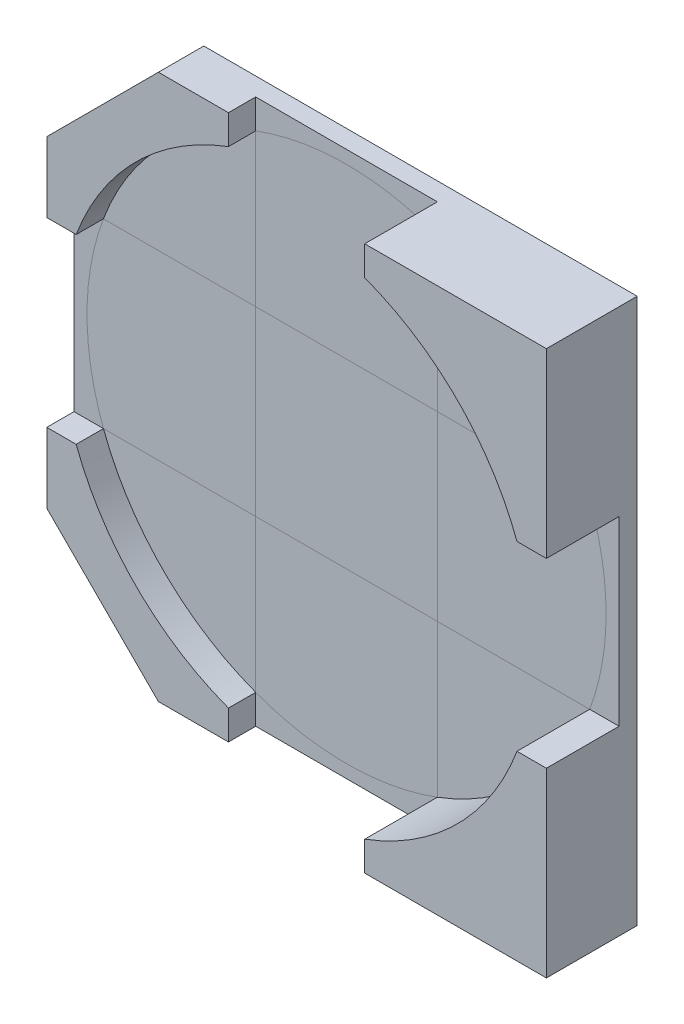
ISO-10303-21;
HEADER;
FILE_DESCRIPTION(('STEP AP214'),'2;1');
FILE_NAME('part.step','',(''),(''),'','','');
FILE_SCHEMA(('AUTOMOTIVE_DESIGN { 1 0 10303 214 1 1 1 1 }'));
ENDSEC;
DATA;
#1=APPLICATION_CONTEXT('core data for automotive mechanical design processes');
#2=APPLICATION_PROTOCOL_DEFINITION('international standard','automotive_design',2000,#1);
#3=PRODUCT_CONTEXT('',#1,'mechanical');
#4=PRODUCT('Part','Part','',(#3));
#5=PRODUCT_RELATED_PRODUCT_CATEGORY('part','',(#4));
#6=PRODUCT_DEFINITION_FORMATION('','',#4);
#7=PRODUCT_DEFINITION_CONTEXT('part definition',#1,'design');
#8=PRODUCT_DEFINITION('design','',#6,#7);
#9=PRODUCT_DEFINITION_SHAPE('','',#8);
#10=(LENGTH_UNIT() NAMED_UNIT(*) SI_UNIT(.MILLI.,.METRE.));
#11=(NAMED_UNIT(*) PLANE_ANGLE_UNIT() SI_UNIT($,.RADIAN.));
#12=(NAMED_UNIT(*) SI_UNIT($,.STERADIAN.) SOLID_ANGLE_UNIT());
#13=UNCERTAINTY_MEASURE_WITH_UNIT(LENGTH_MEASURE(1.E-05),#10,'distance_accuracy_value','');
#14=(GEOMETRIC_REPRESENTATION_CONTEXT(3) GLOBAL_UNCERTAINTY_ASSIGNED_CONTEXT((#13)) GLOBAL_UNIT_ASSIGNED_CONTEXT((#10,
#11,#12)) REPRESENTATION_CONTEXT('',''));
#15=CARTESIAN_POINT('',(0.,0.,0.));
#16=DIRECTION('',(0.,0.,1.));
#17=DIRECTION('',(1.,0.,0.));
#18=AXIS2_PLACEMENT_3D('',#15,#16,#17);
#19=CARTESIAN_POINT('',(0.,0.,0.349966666667));
#20=DIRECTION('',(0.,0.,1.));
#21=DIRECTION('',(1.,0.,0.));
#22=AXIS2_PLACEMENT_3D('',#19,#20,#21);
#23=PLANE('',#22);
#24=DIRECTION('',(1.,0.,0.));
#25=VECTOR('',#24,1.);
#26=CARTESIAN_POINT('',(-5.25,1.75,0.349966666667));
#27=LINE('',#26,#25);
#28=CARTESIAN_POINT('',(1.75,1.75,0.349966666667));
#29=VERTEX_POINT('',#28);
#30=CARTESIAN_POINT('',(4.683748498799,1.75,0.349966666667));
#31=VERTEX_POINT('',#30);
#32=EDGE_CURVE('E189',#29,#31,#27,.T.);
#33=ORIENTED_EDGE('',*,*,#32,.T.);
#34=CARTESIAN_POINT('',(0.,0.,0.349966666667));
#35=DIRECTION('',(0.,0.,1.));
#36=DIRECTION('',(1.,0.,0.));
#37=AXIS2_PLACEMENT_3D('',#34,#35,#36);
#38=CIRCLE('',#37,5.);
#39=CARTESIAN_POINT('',(1.75,4.683748498799,0.349966666667));
#40=VERTEX_POINT('',#39);
#41=EDGE_CURVE('E11',#31,#40,#38,.T.);
#42=ORIENTED_EDGE('',*,*,#41,.T.);
#43=DIRECTION('',(0.,1.,0.));
#44=VECTOR('',#43,1.);
#45=CARTESIAN_POINT('',(1.75,-5.25,0.349966666667));
#46=LINE('',#45,#44);
#47=EDGE_CURVE('E200',#29,#40,#46,.T.);
#48=ORIENTED_EDGE('',*,*,#47,.F.);
#49=EDGE_LOOP('',(#33,#42,#48));
#50=FACE_BOUND('',#49,.T.);
#51=ADVANCED_FACE('F17',(#50),#23,.T.);
#52=CARTESIAN_POINT('',(0.,0.,0.349966666667));
#53=DIRECTION('',(0.,0.,1.));
#54=DIRECTION('',(1.,0.,0.));
#55=AXIS2_PLACEMENT_3D('',#52,#53,#54);
#56=PLANE('',#55);
#57=CARTESIAN_POINT('',(0.,0.,0.349966666667));
#58=DIRECTION('',(0.,0.,1.));
#59=DIRECTION('',(1.,0.,0.));
#60=AXIS2_PLACEMENT_3D('',#57,#58,#59);
#61=CIRCLE('',#60,5.);
#62=CARTESIAN_POINT('',(1.75,-4.683748498799,0.349966666667));
#63=VERTEX_POINT('',#62);
#64=CARTESIAN_POINT('',(4.683748498799,-1.75,0.349966666667));
#65=VERTEX_POINT('',#64);
#66=EDGE_CURVE('E208',#63,#65,#61,.T.);
#67=ORIENTED_EDGE('',*,*,#66,.T.);
#68=DIRECTION('',(1.,0.,0.));
#69=VECTOR('',#68,1.);
#70=CARTESIAN_POINT('',(-5.25,-1.75,0.349966666667));
#71=LINE('',#70,#69);
#72=CARTESIAN_POINT('',(1.75,-1.75,0.349966666667));
#73=VERTEX_POINT('',#72);
#74=EDGE_CURVE('E28',#73,#65,#71,.T.);
#75=ORIENTED_EDGE('',*,*,#74,.F.);
#76=DIRECTION('',(0.,1.,0.));
#77=VECTOR('',#76,1.);
#78=CARTESIAN_POINT('',(1.75,-5.25,0.349966666667));
#79=LINE('',#78,#77);
#80=EDGE_CURVE('E283',#63,#73,#79,.T.);
#81=ORIENTED_EDGE('',*,*,#80,.F.);
#82=EDGE_LOOP('',(#67,#75,#81));
#83=FACE_BOUND('',#82,.T.);
#84=ADVANCED_FACE('F572',(#83),#56,.T.);
#85=CARTESIAN_POINT('',(0.,0.,0.349966666667));
#86=DIRECTION('',(0.,0.,1.));
#87=DIRECTION('',(1.,0.,0.));
#88=AXIS2_PLACEMENT_3D('',#85,#86,#87);
#89=CYLINDRICAL_SURFACE('',#88,5.);
#90=CARTESIAN_POINT('',(0.,0.,1.749833333333));
#91=DIRECTION('',(0.,0.,1.));
#92=DIRECTION('',(1.,0.,0.));
#93=AXIS2_PLACEMENT_3D('',#90,#91,#92);
#94=CIRCLE('',#93,5.);
#95=CARTESIAN_POINT('',(4.683748498799,1.75,1.749833333333));
#96=VERTEX_POINT('',#95);
#97=CARTESIAN_POINT('',(1.75,4.683748498799,1.749833333333));
#98=VERTEX_POINT('',#97);
#99=EDGE_CURVE('E236',#96,#98,#94,.T.);
#100=ORIENTED_EDGE('',*,*,#99,.T.);
#101=DIRECTION('',(0.,0.,1.));
#102=VECTOR('',#101,1.);
#103=CARTESIAN_POINT('',(1.75,4.683748498799,0.349966666667));
#104=LINE('',#103,#102);
#105=EDGE_CURVE('E421',#40,#98,#104,.T.);
#106=ORIENTED_EDGE('',*,*,#105,.F.);
#107=ORIENTED_EDGE('',*,*,#41,.F.);
#108=DIRECTION('',(0.,0.,1.));
#109=VECTOR('',#108,1.);
#110=CARTESIAN_POINT('',(4.683748498799,1.75,0.349966666667));
#111=LINE('',#110,#109);
#112=EDGE_CURVE('E383',#31,#96,#111,.T.);
#113=ORIENTED_EDGE('',*,*,#112,.T.);
#114=EDGE_LOOP('',(#100,#106,#107,#113));
#115=FACE_BOUND('',#114,.T.);
#116=ADVANCED_FACE('F577',(#115),#89,.F.);
#117=CARTESIAN_POINT('',(-5.25,-1.75,0.349966666667));
#118=DIRECTION('',(0.,0.,1.));
#119=DIRECTION('',(1.,0.,0.));
#120=AXIS2_PLACEMENT_3D('',#117,#118,#119);
#121=PLANE('',#120);
#122=ORIENTED_EDGE('',*,*,#32,.F.);
#123=DIRECTION('',(0.,1.,0.));
#124=VECTOR('',#123,1.);
#125=CARTESIAN_POINT('',(1.75,-5.25,0.349966666667));
#126=LINE('',#125,#124);
#127=EDGE_CURVE('E193',#73,#29,#126,.T.);
#128=ORIENTED_EDGE('',*,*,#127,.F.);
#129=ORIENTED_EDGE('',*,*,#74,.T.);
#130=CARTESIAN_POINT('',(0.,0.,0.349966666667));
#131=DIRECTION('',(0.,0.,1.));
#132=DIRECTION('',(1.,0.,0.));
#133=AXIS2_PLACEMENT_3D('',#130,#131,#132);
#134=CIRCLE('',#133,5.);
#135=CARTESIAN_POINT('',(5.,0.,0.349966666667));
#136=VERTEX_POINT('',#135);
#137=EDGE_CURVE('E42',#65,#136,#134,.T.);
#138=ORIENTED_EDGE('',*,*,#137,.T.);
#139=CARTESIAN_POINT('',(0.,0.,0.349966666667));
#140=DIRECTION('',(0.,0.,1.));
#141=DIRECTION('',(1.,0.,0.));
#142=AXIS2_PLACEMENT_3D('',#139,#140,#141);
#143=CIRCLE('',#142,5.);
#144=EDGE_CURVE('E195',#136,#31,#143,.T.);
#145=ORIENTED_EDGE('',*,*,#144,.T.);
#146=EDGE_LOOP('',(#122,#128,#129,#138,#145));
#147=FACE_BOUND('',#146,.T.);
#148=ADVANCED_FACE('F191',(#147),#121,.T.);
#149=CARTESIAN_POINT('',(-1.75,-5.25,0.349966666667));
#150=DIRECTION('',(0.,0.,1.));
#151=DIRECTION('',(1.,0.,0.));
#152=AXIS2_PLACEMENT_3D('',#149,#150,#151);
#153=PLANE('',#152);
#154=DIRECTION('',(0.,1.,0.));
#155=VECTOR('',#154,1.);
#156=CARTESIAN_POINT('',(-1.75,-5.25,0.349966666667));
#157=LINE('',#156,#155);
#158=CARTESIAN_POINT('',(-1.75,1.75,0.349966666667));
#159=VERTEX_POINT('',#158);
#160=CARTESIAN_POINT('',(-1.75,4.683748498799,0.349966666667));
#161=VERTEX_POINT('',#160);
#162=EDGE_CURVE('E222',#159,#161,#157,.T.);
#163=ORIENTED_EDGE('',*,*,#162,.F.);
#164=DIRECTION('',(1.,0.,0.));
#165=VECTOR('',#164,1.);
#166=CARTESIAN_POINT('',(-5.25,1.75,0.349966666667));
#167=LINE('',#166,#165);
#168=EDGE_CURVE('E214',#159,#29,#167,.T.);
#169=ORIENTED_EDGE('',*,*,#168,.T.);
#170=ORIENTED_EDGE('',*,*,#47,.T.);
#171=CARTESIAN_POINT('',(0.,0.,0.349966666667));
#172=DIRECTION('',(0.,0.,1.));
#173=DIRECTION('',(1.,0.,0.));
#174=AXIS2_PLACEMENT_3D('',#171,#172,#173);
#175=CIRCLE('',#174,5.);
#176=EDGE_CURVE('E425',#40,#161,#175,.T.);
#177=ORIENTED_EDGE('',*,*,#176,.T.);
#178=EDGE_LOOP('',(#163,#169,#170,#177));
#179=FACE_BOUND('',#178,.T.);
#180=ADVANCED_FACE('F220',(#179),#153,.T.);
#181=CARTESIAN_POINT('',(0.,0.,0.349966666667));
#182=DIRECTION('',(0.,0.,1.));
#183=DIRECTION('',(1.,0.,0.));
#184=AXIS2_PLACEMENT_3D('',#181,#182,#183);
#185=CYLINDRICAL_SURFACE('',#184,5.);
#186=DIRECTION('',(0.,0.,1.));
#187=VECTOR('',#186,1.);
#188=CARTESIAN_POINT('',(1.75,-4.683748498799,0.349966666667));
#189=LINE('',#188,#187);
#190=CARTESIAN_POINT('',(1.75,-4.683748498799,1.749833333333));
#191=VERTEX_POINT('',#190);
#192=EDGE_CURVE('E232',#63,#191,#189,.T.);
#193=ORIENTED_EDGE('',*,*,#192,.T.);
#194=CARTESIAN_POINT('',(0.,0.,1.749833333333));
#195=DIRECTION('',(0.,0.,1.));
#196=DIRECTION('',(1.,0.,0.));
#197=AXIS2_PLACEMENT_3D('',#194,#195,#196);
#198=CIRCLE('',#197,5.);
#199=CARTESIAN_POINT('',(4.683748498799,-1.75,1.749833333333));
#200=VERTEX_POINT('',#199);
#201=EDGE_CURVE('E305',#191,#200,#198,.T.);
#202=ORIENTED_EDGE('',*,*,#201,.T.);
#203=DIRECTION('',(0.,0.,1.));
#204=VECTOR('',#203,1.);
#205=CARTESIAN_POINT('',(4.683748498799,-1.75,0.349966666667));
#206=LINE('',#205,#204);
#207=EDGE_CURVE('E367',#65,#200,#206,.T.);
#208=ORIENTED_EDGE('',*,*,#207,.F.);
#209=ORIENTED_EDGE('',*,*,#66,.F.);
#210=EDGE_LOOP('',(#193,#202,#208,#209));
#211=FACE_BOUND('',#210,.T.);
#212=ADVANCED_FACE('F769',(#211),#185,.F.);
#213=CARTESIAN_POINT('',(-1.75,-5.25,0.349966666667));
#214=DIRECTION('',(0.,0.,1.));
#215=DIRECTION('',(1.,0.,0.));
#216=AXIS2_PLACEMENT_3D('',#213,#214,#215);
#217=PLANE('',#216);
#218=DIRECTION('',(0.,1.,0.));
#219=VECTOR('',#218,1.);
#220=CARTESIAN_POINT('',(-1.75,-5.25,0.349966666667));
#221=LINE('',#220,#219);
#222=CARTESIAN_POINT('',(-1.75,-4.683748498799,0.349966666667));
#223=VERTEX_POINT('',#222);
#224=CARTESIAN_POINT('',(-1.75,-1.75,0.349966666667));
#225=VERTEX_POINT('',#224);
#226=EDGE_CURVE('E400',#223,#225,#221,.T.);
#227=ORIENTED_EDGE('',*,*,#226,.F.);
#228=CARTESIAN_POINT('',(0.,0.,0.349966666667));
#229=DIRECTION('',(0.,0.,1.));
#230=DIRECTION('',(1.,0.,0.));
#231=AXIS2_PLACEMENT_3D('',#228,#229,#230);
#232=CIRCLE('',#231,5.);
#233=EDGE_CURVE('E351',#223,#63,#232,.T.);
#234=ORIENTED_EDGE('',*,*,#233,.T.);
#235=ORIENTED_EDGE('',*,*,#80,.T.);
#236=DIRECTION('',(1.,0.,0.));
#237=VECTOR('',#236,1.);
#238=CARTESIAN_POINT('',(-5.25,-1.75,0.349966666667));
#239=LINE('',#238,#237);
#240=EDGE_CURVE('E216',#225,#73,#239,.T.);
#241=ORIENTED_EDGE('',*,*,#240,.F.);
#242=EDGE_LOOP('',(#227,#234,#235,#241));
#243=FACE_BOUND('',#242,.T.);
#244=ADVANCED_FACE('F625',(#243),#217,.T.);
#245=CARTESIAN_POINT('',(-5.25,1.75,0.349966666667));
#246=DIRECTION('',(0.,1.,0.));
#247=DIRECTION('',(1.,0.,0.));
#248=AXIS2_PLACEMENT_3D('',#245,#246,#247);
#249=PLANE('',#248);
#250=DIRECTION('',(-1.,0.,0.));
#251=VECTOR('',#250,1.);
#252=CARTESIAN_POINT('',(-5.25,1.75,1.749833333333));
#253=LINE('',#252,#251);
#254=CARTESIAN_POINT('',(5.25,1.75,1.749833333333));
#255=VERTEX_POINT('',#254);
#256=EDGE_CURVE('E245',#255,#96,#253,.T.);
#257=ORIENTED_EDGE('',*,*,#256,.T.);
#258=ORIENTED_EDGE('',*,*,#112,.F.);
#259=DIRECTION('',(1.,0.,0.));
#260=VECTOR('',#259,1.);
#261=CARTESIAN_POINT('',(-5.25,1.75,0.349966666667));
#262=LINE('',#261,#260);
#263=CARTESIAN_POINT('',(5.25,1.75,0.349966666667));
#264=VERTEX_POINT('',#263);
#265=EDGE_CURVE('E370',#31,#264,#262,.T.);
#266=ORIENTED_EDGE('',*,*,#265,.T.);
#267=DIRECTION('',(0.,0.,1.));
#268=VECTOR('',#267,1.);
#269=CARTESIAN_POINT('',(5.25,1.75,0.349966666667));
#270=LINE('',#269,#268);
#271=EDGE_CURVE('E366',#264,#255,#270,.T.);
#272=ORIENTED_EDGE('',*,*,#271,.T.);
#273=EDGE_LOOP('',(#257,#258,#266,#272));
#274=FACE_BOUND('',#273,.T.);
#275=ADVANCED_FACE('F623',(#274),#249,.F.);
#276=CARTESIAN_POINT('',(-5.25,-1.75,0.349966666667));
#277=DIRECTION('',(0.,0.,1.));
#278=DIRECTION('',(1.,0.,0.));
#279=AXIS2_PLACEMENT_3D('',#276,#277,#278);
#280=PLANE('',#279);
#281=ORIENTED_EDGE('',*,*,#265,.F.);
#282=ORIENTED_EDGE('',*,*,#144,.F.);
#283=ORIENTED_EDGE('',*,*,#137,.F.);
#284=DIRECTION('',(1.,0.,0.));
#285=VECTOR('',#284,1.);
#286=CARTESIAN_POINT('',(-5.25,-1.75,0.349966666667));
#287=LINE('',#286,#285);
#288=CARTESIAN_POINT('',(5.25,-1.75,0.349966666667));
#289=VERTEX_POINT('',#288);
#290=EDGE_CURVE('E371',#65,#289,#287,.T.);
#291=ORIENTED_EDGE('',*,*,#290,.T.);
#292=DIRECTION('',(0.,1.,0.));
#293=VECTOR('',#292,1.);
#294=CARTESIAN_POINT('',(5.25,-1.75,0.349966666667));
#295=LINE('',#294,#293);
#296=EDGE_CURVE('E432',#289,#264,#295,.T.);
#297=ORIENTED_EDGE('',*,*,#296,.T.);
#298=EDGE_LOOP('',(#281,#282,#283,#291,#297));
#299=FACE_BOUND('',#298,.T.);
#300=ADVANCED_FACE('F598',(#299),#280,.T.);
#301=CARTESIAN_POINT('',(-5.25,-1.75,0.349966666667));
#302=DIRECTION('',(0.,1.,0.));
#303=DIRECTION('',(1.,0.,0.));
#304=AXIS2_PLACEMENT_3D('',#301,#302,#303);
#305=PLANE('',#304);
#306=DIRECTION('',(0.,0.,1.));
#307=VECTOR('',#306,1.);
#308=CARTESIAN_POINT('',(5.25,-1.75,0.349966666667));
#309=LINE('',#308,#307);
#310=CARTESIAN_POINT('',(5.25,-1.75,1.749833333333));
#311=VERTEX_POINT('',#310);
#312=EDGE_CURVE('E454',#289,#311,#309,.T.);
#313=ORIENTED_EDGE('',*,*,#312,.F.);
#314=ORIENTED_EDGE('',*,*,#290,.F.);
#315=ORIENTED_EDGE('',*,*,#207,.T.);
#316=DIRECTION('',(-1.,0.,0.));
#317=VECTOR('',#316,1.);
#318=CARTESIAN_POINT('',(-5.25,-1.75,1.749833333333));
#319=LINE('',#318,#317);
#320=EDGE_CURVE('E355',#311,#200,#319,.T.);
#321=ORIENTED_EDGE('',*,*,#320,.F.);
#322=EDGE_LOOP('',(#313,#314,#315,#321));
#323=FACE_BOUND('',#322,.T.);
#324=ADVANCED_FACE('F595',(#323),#305,.T.);
#325=CARTESIAN_POINT('',(-1.75,-5.25,0.349966666667));
#326=DIRECTION('',(0.,0.,1.));
#327=DIRECTION('',(1.,0.,0.));
#328=AXIS2_PLACEMENT_3D('',#325,#326,#327);
#329=PLANE('',#328);
#330=DIRECTION('',(0.,1.,0.));
#331=VECTOR('',#330,1.);
#332=CARTESIAN_POINT('',(-1.75,-5.25,0.349966666667));
#333=LINE('',#332,#331);
#334=CARTESIAN_POINT('',(-1.75,5.25,0.349966666667));
#335=VERTEX_POINT('',#334);
#336=EDGE_CURVE('E299',#161,#335,#333,.T.);
#337=ORIENTED_EDGE('',*,*,#336,.F.);
#338=ORIENTED_EDGE('',*,*,#176,.F.);
#339=DIRECTION('',(0.,1.,0.));
#340=VECTOR('',#339,1.);
#341=CARTESIAN_POINT('',(1.75,-5.25,0.349966666667));
#342=LINE('',#341,#340);
#343=CARTESIAN_POINT('',(1.75,5.25,0.349966666667));
#344=VERTEX_POINT('',#343);
#345=EDGE_CURVE('E21',#40,#344,#342,.T.);
#346=ORIENTED_EDGE('',*,*,#345,.T.);
#347=DIRECTION('',(1.,0.,0.));
#348=VECTOR('',#347,1.);
#349=CARTESIAN_POINT('',(-1.75,5.25,0.349966666667));
#350=LINE('',#349,#348);
#351=EDGE_CURVE('E278',#335,#344,#350,.T.);
#352=ORIENTED_EDGE('',*,*,#351,.F.);
#353=EDGE_LOOP('',(#337,#338,#346,#352));
#354=FACE_BOUND('',#353,.T.);
#355=ADVANCED_FACE('F19',(#354),#329,.T.);
#356=CARTESIAN_POINT('',(1.75,-5.25,0.349966666667));
#357=DIRECTION('',(1.,0.,0.));
#358=DIRECTION('',(0.,1.,0.));
#359=AXIS2_PLACEMENT_3D('',#356,#357,#358);
#360=PLANE('',#359);
#361=DIRECTION('',(0.,0.,1.));
#362=VECTOR('',#361,1.);
#363=CARTESIAN_POINT('',(1.75,5.25,0.349966666667));
#364=LINE('',#363,#362);
#365=CARTESIAN_POINT('',(1.75,5.25,1.749833333333));
#366=VERTEX_POINT('',#365);
#367=EDGE_CURVE('E388',#344,#366,#364,.T.);
#368=ORIENTED_EDGE('',*,*,#367,.F.);
#369=ORIENTED_EDGE('',*,*,#345,.F.);
#370=ORIENTED_EDGE('',*,*,#105,.T.);
#371=DIRECTION('',(0.,1.,0.));
#372=VECTOR('',#371,1.);
#373=CARTESIAN_POINT('',(1.75,-5.25,1.749833333333));
#374=LINE('',#373,#372);
#375=EDGE_CURVE('E218',#98,#366,#374,.T.);
#376=ORIENTED_EDGE('',*,*,#375,.T.);
#377=EDGE_LOOP('',(#368,#369,#370,#376));
#378=FACE_BOUND('',#377,.T.);
#379=ADVANCED_FACE('F654',(#378),#360,.F.);
#380=CARTESIAN_POINT('',(-5.25,-5.25,1.749833333333));
#381=DIRECTION('',(0.,0.,1.));
#382=DIRECTION('',(1.,0.,0.));
#383=AXIS2_PLACEMENT_3D('',#380,#381,#382);
#384=PLANE('',#383);
#385=ORIENTED_EDGE('',*,*,#375,.F.);
#386=ORIENTED_EDGE('',*,*,#99,.F.);
#387=ORIENTED_EDGE('',*,*,#256,.F.);
#388=DIRECTION('',(0.,1.,0.));
#389=VECTOR('',#388,1.);
#390=CARTESIAN_POINT('',(5.25,-5.25,1.749833333333));
#391=LINE('',#390,#389);
#392=CARTESIAN_POINT('',(5.25,5.25,1.749833333333));
#393=VERTEX_POINT('',#392);
#394=EDGE_CURVE('E298',#255,#393,#391,.T.);
#395=ORIENTED_EDGE('',*,*,#394,.T.);
#396=DIRECTION('',(1.,0.,0.));
#397=VECTOR('',#396,1.);
#398=CARTESIAN_POINT('',(-5.25,5.25,1.749833333333));
#399=LINE('',#398,#397);
#400=EDGE_CURVE('E500',#366,#393,#399,.T.);
#401=ORIENTED_EDGE('',*,*,#400,.F.);
#402=EDGE_LOOP('',(#385,#386,#387,#395,#401));
#403=FACE_BOUND('',#402,.T.);
#404=ADVANCED_FACE('F618',(#403),#384,.T.);
#405=CARTESIAN_POINT('',(-5.25,-1.75,0.349966666667));
#406=DIRECTION('',(0.,0.,1.));
#407=DIRECTION('',(1.,0.,0.));
#408=AXIS2_PLACEMENT_3D('',#405,#406,#407);
#409=PLANE('',#408);
#410=ORIENTED_EDGE('',*,*,#168,.F.);
#411=DIRECTION('',(0.,1.,0.));
#412=VECTOR('',#411,1.);
#413=CARTESIAN_POINT('',(-1.75,-5.25,0.349966666667));
#414=LINE('',#413,#412);
#415=EDGE_CURVE('E350',#225,#159,#414,.T.);
#416=ORIENTED_EDGE('',*,*,#415,.F.);
#417=ORIENTED_EDGE('',*,*,#240,.T.);
#418=ORIENTED_EDGE('',*,*,#127,.T.);
#419=EDGE_LOOP('',(#410,#416,#417,#418));
#420=FACE_BOUND('',#419,.T.);
#421=ADVANCED_FACE('F212',(#420),#409,.T.);
#422=CARTESIAN_POINT('',(0.,0.,0.349966666667));
#423=DIRECTION('',(0.,0.,1.));
#424=DIRECTION('',(1.,0.,0.));
#425=AXIS2_PLACEMENT_3D('',#422,#423,#424);
#426=PLANE('',#425);
#427=ORIENTED_EDGE('',*,*,#162,.T.);
#428=CARTESIAN_POINT('',(0.,0.,0.349966666667));
#429=DIRECTION('',(0.,0.,1.));
#430=DIRECTION('',(1.,0.,0.));
#431=AXIS2_PLACEMENT_3D('',#428,#429,#430);
#432=CIRCLE('',#431,5.);
#433=CARTESIAN_POINT('',(-4.683748498799,1.75,0.349966666667));
#434=VERTEX_POINT('',#433);
#435=EDGE_CURVE('E414',#161,#434,#432,.T.);
#436=ORIENTED_EDGE('',*,*,#435,.T.);
#437=DIRECTION('',(1.,0.,0.));
#438=VECTOR('',#437,1.);
#439=CARTESIAN_POINT('',(-5.25,1.75,0.349966666667));
#440=LINE('',#439,#438);
#441=EDGE_CURVE('E331',#434,#159,#440,.T.);
#442=ORIENTED_EDGE('',*,*,#441,.T.);
#443=EDGE_LOOP('',(#427,#436,#442));
#444=FACE_BOUND('',#443,.T.);
#445=ADVANCED_FACE('F617',(#444),#426,.T.);
#446=CARTESIAN_POINT('',(1.75,-5.25,0.349966666667));
#447=DIRECTION('',(1.,0.,0.));
#448=DIRECTION('',(0.,1.,0.));
#449=AXIS2_PLACEMENT_3D('',#446,#447,#448);
#450=PLANE('',#449);
#451=DIRECTION('',(0.,1.,0.));
#452=VECTOR('',#451,1.);
#453=CARTESIAN_POINT('',(1.75,-5.25,1.749833333333));
#454=LINE('',#453,#452);
#455=CARTESIAN_POINT('',(1.75,-5.25,1.749833333333));
#456=VERTEX_POINT('',#455);
#457=EDGE_CURVE('E239',#456,#191,#454,.T.);
#458=ORIENTED_EDGE('',*,*,#457,.T.);
#459=ORIENTED_EDGE('',*,*,#192,.F.);
#460=DIRECTION('',(0.,1.,0.));
#461=VECTOR('',#460,1.);
#462=CARTESIAN_POINT('',(1.75,-5.25,0.349966666667));
#463=LINE('',#462,#461);
#464=CARTESIAN_POINT('',(1.75,-5.25,0.349966666667));
#465=VERTEX_POINT('',#464);
#466=EDGE_CURVE('E356',#465,#63,#463,.T.);
#467=ORIENTED_EDGE('',*,*,#466,.F.);
#468=DIRECTION('',(0.,0.,1.));
#469=VECTOR('',#468,1.);
#470=CARTESIAN_POINT('',(1.75,-5.25,0.349966666667));
#471=LINE('',#470,#469);
#472=EDGE_CURVE('E342',#465,#456,#471,.T.);
#473=ORIENTED_EDGE('',*,*,#472,.T.);
#474=EDGE_LOOP('',(#458,#459,#467,#473));
#475=FACE_BOUND('',#474,.T.);
#476=ADVANCED_FACE('F621',(#475),#450,.F.);
#477=CARTESIAN_POINT('',(-5.25,-5.25,1.749833333333));
#478=DIRECTION('',(0.,0.,1.));
#479=DIRECTION('',(1.,0.,0.));
#480=AXIS2_PLACEMENT_3D('',#477,#478,#479);
#481=PLANE('',#480);
#482=DIRECTION('',(0.,1.,0.));
#483=VECTOR('',#482,1.);
#484=CARTESIAN_POINT('',(5.25,-5.25,1.749833333333));
#485=LINE('',#484,#483);
#486=CARTESIAN_POINT('',(5.25,-5.25,1.749833333333));
#487=VERTEX_POINT('',#486);
#488=EDGE_CURVE('E294',#487,#311,#485,.T.);
#489=ORIENTED_EDGE('',*,*,#488,.T.);
#490=ORIENTED_EDGE('',*,*,#320,.T.);
#491=ORIENTED_EDGE('',*,*,#201,.F.);
#492=ORIENTED_EDGE('',*,*,#457,.F.);
#493=DIRECTION('',(1.,0.,0.));
#494=VECTOR('',#493,1.);
#495=CARTESIAN_POINT('',(-5.25,-5.25,1.749833333333));
#496=LINE('',#495,#494);
#497=EDGE_CURVE('E346',#456,#487,#496,.T.);
#498=ORIENTED_EDGE('',*,*,#497,.T.);
#499=EDGE_LOOP('',(#489,#490,#491,#492,#498));
#500=FACE_BOUND('',#499,.T.);
#501=ADVANCED_FACE('F602',(#500),#481,.T.);
#502=CARTESIAN_POINT('',(-1.75,-5.25,0.349966666667));
#503=DIRECTION('',(0.,0.,1.));
#504=DIRECTION('',(1.,0.,0.));
#505=AXIS2_PLACEMENT_3D('',#502,#503,#504);
#506=PLANE('',#505);
#507=DIRECTION('',(0.,1.,0.));
#508=VECTOR('',#507,1.);
#509=CARTESIAN_POINT('',(-1.75,-5.25,0.349966666667));
#510=LINE('',#509,#508);
#511=CARTESIAN_POINT('',(-1.75,-5.25,0.349966666667));
#512=VERTEX_POINT('',#511);
#513=EDGE_CURVE('E273',#512,#223,#510,.T.);
#514=ORIENTED_EDGE('',*,*,#513,.F.);
#515=DIRECTION('',(1.,0.,0.));
#516=VECTOR('',#515,1.);
#517=CARTESIAN_POINT('',(-1.75,-5.25,0.349966666667));
#518=LINE('',#517,#516);
#519=EDGE_CURVE('E335',#512,#465,#518,.T.);
#520=ORIENTED_EDGE('',*,*,#519,.T.);
#521=ORIENTED_EDGE('',*,*,#466,.T.);
#522=ORIENTED_EDGE('',*,*,#233,.F.);
#523=EDGE_LOOP('',(#514,#520,#521,#522));
#524=FACE_BOUND('',#523,.T.);
#525=ADVANCED_FACE('F600',(#524),#506,.T.);
#526=CARTESIAN_POINT('',(0.,0.,0.349966666667));
#527=DIRECTION('',(0.,0.,1.));
#528=DIRECTION('',(1.,0.,0.));
#529=AXIS2_PLACEMENT_3D('',#526,#527,#528);
#530=PLANE('',#529);
#531=CARTESIAN_POINT('',(0.,0.,0.349966666667));
#532=DIRECTION('',(0.,0.,1.));
#533=DIRECTION('',(1.,0.,0.));
#534=AXIS2_PLACEMENT_3D('',#531,#532,#533);
#535=CIRCLE('',#534,5.);
#536=CARTESIAN_POINT('',(-4.683748498799,-1.75,0.349966666667));
#537=VERTEX_POINT('',#536);
#538=EDGE_CURVE('E274',#537,#223,#535,.T.);
#539=ORIENTED_EDGE('',*,*,#538,.T.);
#540=ORIENTED_EDGE('',*,*,#226,.T.);
#541=DIRECTION('',(1.,0.,0.));
#542=VECTOR('',#541,1.);
#543=CARTESIAN_POINT('',(-5.25,-1.75,0.349966666667));
#544=LINE('',#543,#542);
#545=EDGE_CURVE('E334',#537,#225,#544,.T.);
#546=ORIENTED_EDGE('',*,*,#545,.F.);
#547=EDGE_LOOP('',(#539,#540,#546));
#548=FACE_BOUND('',#547,.T.);
#549=ADVANCED_FACE('F548',(#548),#530,.T.);
#550=CARTESIAN_POINT('',(5.25,-5.25,0.));
#551=DIRECTION('',(1.,0.,0.));
#552=DIRECTION('',(0.,1.,0.));
#553=AXIS2_PLACEMENT_3D('',#550,#551,#552);
#554=PLANE('',#553);
#555=ORIENTED_EDGE('',*,*,#488,.F.);
#556=DIRECTION('',(0.,0.,1.));
#557=VECTOR('',#556,1.);
#558=CARTESIAN_POINT('',(5.25,-5.25,0.));
#559=LINE('',#558,#557);
#560=CARTESIAN_POINT('',(5.25,-5.25,0.));
#561=VERTEX_POINT('',#560);
#562=EDGE_CURVE('E410',#561,#487,#559,.T.);
#563=ORIENTED_EDGE('',*,*,#562,.F.);
#564=DIRECTION('',(0.,1.,0.));
#565=VECTOR('',#564,1.);
#566=CARTESIAN_POINT('',(5.25,-5.25,0.));
#567=LINE('',#566,#565);
#568=CARTESIAN_POINT('',(5.25,5.25,0.));
#569=VERTEX_POINT('',#568);
#570=EDGE_CURVE('E325',#561,#569,#567,.T.);
#571=ORIENTED_EDGE('',*,*,#570,.T.);
#572=DIRECTION('',(0.,0.,1.));
#573=VECTOR('',#572,1.);
#574=CARTESIAN_POINT('',(5.25,5.25,0.));
#575=LINE('',#574,#573);
#576=EDGE_CURVE('E463',#569,#393,#575,.T.);
#577=ORIENTED_EDGE('',*,*,#576,.T.);
#578=ORIENTED_EDGE('',*,*,#394,.F.);
#579=ORIENTED_EDGE('',*,*,#271,.F.);
#580=ORIENTED_EDGE('',*,*,#296,.F.);
#581=ORIENTED_EDGE('',*,*,#312,.T.);
#582=EDGE_LOOP('',(#555,#563,#571,#577,#578,#579,#580,#581));
#583=FACE_BOUND('',#582,.T.);
#584=ADVANCED_FACE('F593',(#583),#554,.T.);
#585=CARTESIAN_POINT('',(-1.75,-5.25,0.349966666667));
#586=DIRECTION('',(1.,0.,0.));
#587=DIRECTION('',(0.,1.,0.));
#588=AXIS2_PLACEMENT_3D('',#585,#586,#587);
#589=PLANE('',#588);
#590=DIRECTION('',(0.,0.,1.));
#591=VECTOR('',#590,1.);
#592=CARTESIAN_POINT('',(-1.75,5.25,0.349966666667));
#593=LINE('',#592,#591);
#594=CARTESIAN_POINT('',(-1.75,5.25,0.874916666667));
#595=VERTEX_POINT('',#594);
#596=EDGE_CURVE('E275',#335,#595,#593,.T.);
#597=ORIENTED_EDGE('',*,*,#596,.T.);
#598=DIRECTION('',(0.,-1.,0.));
#599=VECTOR('',#598,1.);
#600=CARTESIAN_POINT('',(-1.75,-5.25,0.874916666667));
#601=LINE('',#600,#599);
#602=CARTESIAN_POINT('',(-1.75,4.683748498799,0.874916666667));
#603=VERTEX_POINT('',#602);
#604=EDGE_CURVE('E268',#595,#603,#601,.T.);
#605=ORIENTED_EDGE('',*,*,#604,.T.);
#606=DIRECTION('',(0.,0.,1.));
#607=VECTOR('',#606,1.);
#608=CARTESIAN_POINT('',(-1.75,4.683748498799,0.349966666667));
#609=LINE('',#608,#607);
#610=EDGE_CURVE('E279',#161,#603,#609,.T.);
#611=ORIENTED_EDGE('',*,*,#610,.F.);
#612=ORIENTED_EDGE('',*,*,#336,.T.);
#613=EDGE_LOOP('',(#597,#605,#611,#612));
#614=FACE_BOUND('',#613,.T.);
#615=ADVANCED_FACE('F589',(#614),#589,.T.);
#616=CARTESIAN_POINT('',(-5.25,5.25,0.));
#617=DIRECTION('',(0.,1.,0.));
#618=DIRECTION('',(1.,0.,0.));
#619=AXIS2_PLACEMENT_3D('',#616,#617,#618);
#620=PLANE('',#619);
#621=DIRECTION('',(1.,0.,0.));
#622=VECTOR('',#621,1.);
#623=CARTESIAN_POINT('',(-5.25,5.25,0.));
#624=LINE('',#623,#622);
#625=CARTESIAN_POINT('',(-3.1,5.25,0.));
#626=VERTEX_POINT('',#625);
#627=EDGE_CURVE('E315',#626,#569,#624,.T.);
#628=ORIENTED_EDGE('',*,*,#627,.F.);
#629=DIRECTION('',(0.,0.,1.));
#630=VECTOR('',#629,1.);
#631=CARTESIAN_POINT('',(-3.1,5.25,0.));
#632=LINE('',#631,#630);
#633=CARTESIAN_POINT('',(-3.1,5.25,0.874916666667));
#634=VERTEX_POINT('',#633);
#635=EDGE_CURVE('E243',#626,#634,#632,.T.);
#636=ORIENTED_EDGE('',*,*,#635,.T.);
#637=DIRECTION('',(1.,0.,0.));
#638=VECTOR('',#637,1.);
#639=CARTESIAN_POINT('',(-5.25,5.25,0.874916666667));
#640=LINE('',#639,#638);
#641=EDGE_CURVE('E244',#634,#595,#640,.T.);
#642=ORIENTED_EDGE('',*,*,#641,.T.);
#643=ORIENTED_EDGE('',*,*,#596,.F.);
#644=ORIENTED_EDGE('',*,*,#351,.T.);
#645=ORIENTED_EDGE('',*,*,#367,.T.);
#646=ORIENTED_EDGE('',*,*,#400,.T.);
#647=ORIENTED_EDGE('',*,*,#576,.F.);
#648=EDGE_LOOP('',(#628,#636,#642,#643,#644,#645,#646,#647));
#649=FACE_BOUND('',#648,.T.);
#650=ADVANCED_FACE('F592',(#649),#620,.T.);
#651=CARTESIAN_POINT('',(0.,0.,0.349966666667));
#652=DIRECTION('',(0.,0.,1.));
#653=DIRECTION('',(1.,0.,0.));
#654=AXIS2_PLACEMENT_3D('',#651,#652,#653);
#655=CYLINDRICAL_SURFACE('',#654,5.);
#656=CARTESIAN_POINT('',(0.,0.,0.874916666667));
#657=DIRECTION('',(0.,0.,1.));
#658=DIRECTION('',(1.,0.,0.));
#659=AXIS2_PLACEMENT_3D('',#656,#657,#658);
#660=CIRCLE('',#659,5.);
#661=CARTESIAN_POINT('',(-4.683748498799,1.75,0.874916666667));
#662=VERTEX_POINT('',#661);
#663=EDGE_CURVE('E265',#603,#662,#660,.T.);
#664=ORIENTED_EDGE('',*,*,#663,.T.);
#665=DIRECTION('',(0.,0.,1.));
#666=VECTOR('',#665,1.);
#667=CARTESIAN_POINT('',(-4.683748498799,1.75,0.349966666667));
#668=LINE('',#667,#666);
#669=EDGE_CURVE('E379',#434,#662,#668,.T.);
#670=ORIENTED_EDGE('',*,*,#669,.F.);
#671=ORIENTED_EDGE('',*,*,#435,.F.);
#672=ORIENTED_EDGE('',*,*,#610,.T.);
#673=EDGE_LOOP('',(#664,#670,#671,#672));
#674=FACE_BOUND('',#673,.T.);
#675=ADVANCED_FACE('F582',(#674),#655,.F.);
#676=CARTESIAN_POINT('',(-5.25,-1.75,0.349966666667));
#677=DIRECTION('',(0.,0.,1.));
#678=DIRECTION('',(1.,0.,0.));
#679=AXIS2_PLACEMENT_3D('',#676,#677,#678);
#680=PLANE('',#679);
#681=ORIENTED_EDGE('',*,*,#441,.F.);
#682=CARTESIAN_POINT('',(0.,0.,0.349966666667));
#683=DIRECTION('',(0.,0.,1.));
#684=DIRECTION('',(1.,0.,0.));
#685=AXIS2_PLACEMENT_3D('',#682,#683,#684);
#686=CIRCLE('',#685,5.);
#687=EDGE_CURVE('E375',#434,#537,#686,.T.);
#688=ORIENTED_EDGE('',*,*,#687,.T.);
#689=ORIENTED_EDGE('',*,*,#545,.T.);
#690=ORIENTED_EDGE('',*,*,#415,.T.);
#691=EDGE_LOOP('',(#681,#688,#689,#690));
#692=FACE_BOUND('',#691,.T.);
#693=ADVANCED_FACE('F552',(#692),#680,.T.);
#694=CARTESIAN_POINT('',(-5.25,-5.25,0.));
#695=DIRECTION('',(0.,1.,0.));
#696=DIRECTION('',(1.,0.,0.));
#697=AXIS2_PLACEMENT_3D('',#694,#695,#696);
#698=PLANE('',#697);
#699=ORIENTED_EDGE('',*,*,#562,.T.);
#700=ORIENTED_EDGE('',*,*,#497,.F.);
#701=ORIENTED_EDGE('',*,*,#472,.F.);
#702=ORIENTED_EDGE('',*,*,#519,.F.);
#703=DIRECTION('',(0.,0.,1.));
#704=VECTOR('',#703,1.);
#705=CARTESIAN_POINT('',(-1.75,-5.25,0.349966666667));
#706=LINE('',#705,#704);
#707=CARTESIAN_POINT('',(-1.75,-5.25,0.874916666667));
#708=VERTEX_POINT('',#707);
#709=EDGE_CURVE('E270',#512,#708,#706,.T.);
#710=ORIENTED_EDGE('',*,*,#709,.T.);
#711=DIRECTION('',(1.,0.,0.));
#712=VECTOR('',#711,1.);
#713=CARTESIAN_POINT('',(-5.25,-5.25,0.874916666667));
#714=LINE('',#713,#712);
#715=CARTESIAN_POINT('',(-3.1,-5.25,0.874916666667));
#716=VERTEX_POINT('',#715);
#717=EDGE_CURVE('E255',#716,#708,#714,.T.);
#718=ORIENTED_EDGE('',*,*,#717,.F.);
#719=DIRECTION('',(0.,0.,1.));
#720=VECTOR('',#719,1.);
#721=CARTESIAN_POINT('',(-3.1,-5.25,0.));
#722=LINE('',#721,#720);
#723=CARTESIAN_POINT('',(-3.1,-5.25,0.));
#724=VERTEX_POINT('',#723);
#725=EDGE_CURVE('E471',#724,#716,#722,.T.);
#726=ORIENTED_EDGE('',*,*,#725,.F.);
#727=DIRECTION('',(1.,0.,0.));
#728=VECTOR('',#727,1.);
#729=CARTESIAN_POINT('',(-5.25,-5.25,0.));
#730=LINE('',#729,#728);
#731=EDGE_CURVE('E341',#724,#561,#730,.T.);
#732=ORIENTED_EDGE('',*,*,#731,.T.);
#733=EDGE_LOOP('',(#699,#700,#701,#702,#710,#718,#726,#732));
#734=FACE_BOUND('',#733,.T.);
#735=ADVANCED_FACE('F628',(#734),#698,.F.);
#736=CARTESIAN_POINT('',(-1.75,-5.25,0.349966666667));
#737=DIRECTION('',(1.,0.,0.));
#738=DIRECTION('',(0.,1.,0.));
#739=AXIS2_PLACEMENT_3D('',#736,#737,#738);
#740=PLANE('',#739);
#741=ORIENTED_EDGE('',*,*,#709,.F.);
#742=ORIENTED_EDGE('',*,*,#513,.T.);
#743=DIRECTION('',(0.,0.,1.));
#744=VECTOR('',#743,1.);
#745=CARTESIAN_POINT('',(-1.75,-4.683748498799,0.349966666667));
#746=LINE('',#745,#744);
#747=CARTESIAN_POINT('',(-1.75,-4.683748498799,0.874916666667));
#748=VERTEX_POINT('',#747);
#749=EDGE_CURVE('E396',#223,#748,#746,.T.);
#750=ORIENTED_EDGE('',*,*,#749,.T.);
#751=DIRECTION('',(0.,-1.,0.));
#752=VECTOR('',#751,1.);
#753=CARTESIAN_POINT('',(-1.75,-5.25,0.874916666667));
#754=LINE('',#753,#752);
#755=EDGE_CURVE('E259',#748,#708,#754,.T.);
#756=ORIENTED_EDGE('',*,*,#755,.T.);
#757=EDGE_LOOP('',(#741,#742,#750,#756));
#758=FACE_BOUND('',#757,.T.);
#759=ADVANCED_FACE('F544',(#758),#740,.T.);
#760=CARTESIAN_POINT('',(0.,0.,0.349966666667));
#761=DIRECTION('',(0.,0.,1.));
#762=DIRECTION('',(1.,0.,0.));
#763=AXIS2_PLACEMENT_3D('',#760,#761,#762);
#764=CYLINDRICAL_SURFACE('',#763,5.);
#765=DIRECTION('',(0.,0.,1.));
#766=VECTOR('',#765,1.);
#767=CARTESIAN_POINT('',(-4.683748498799,-1.75,0.349966666667));
#768=LINE('',#767,#766);
#769=CARTESIAN_POINT('',(-4.683748498799,-1.75,0.874916666667));
#770=VERTEX_POINT('',#769);
#771=EDGE_CURVE('E329',#537,#770,#768,.T.);
#772=ORIENTED_EDGE('',*,*,#771,.T.);
#773=CARTESIAN_POINT('',(0.,0.,0.874916666667));
#774=DIRECTION('',(0.,0.,1.));
#775=DIRECTION('',(1.,0.,0.));
#776=AXIS2_PLACEMENT_3D('',#773,#774,#775);
#777=CIRCLE('',#776,5.);
#778=EDGE_CURVE('E289',#770,#748,#777,.T.);
#779=ORIENTED_EDGE('',*,*,#778,.T.);
#780=ORIENTED_EDGE('',*,*,#749,.F.);
#781=ORIENTED_EDGE('',*,*,#538,.F.);
#782=EDGE_LOOP('',(#772,#779,#780,#781));
#783=FACE_BOUND('',#782,.T.);
#784=ADVANCED_FACE('F541',(#783),#764,.F.);
#785=CARTESIAN_POINT('',(-3.1,-5.25,0.));
#786=DIRECTION('',(-0.707106781186548,-0.707106781186548,0.));
#787=DIRECTION('',(-0.707106781186548,0.707106781186548,0.));
#788=AXIS2_PLACEMENT_3D('',#785,#786,#787);
#789=PLANE('',#788);
#790=DIRECTION('',(-0.707106781186548,0.707106781186548,0.));
#791=VECTOR('',#790,1.);
#792=CARTESIAN_POINT('',(-3.1,-5.25,0.));
#793=LINE('',#792,#791);
#794=CARTESIAN_POINT('',(-5.25,-3.1,0.));
#795=VERTEX_POINT('',#794);
#796=EDGE_CURVE('E406',#724,#795,#793,.T.);
#797=ORIENTED_EDGE('',*,*,#796,.F.);
#798=ORIENTED_EDGE('',*,*,#725,.T.);
#799=DIRECTION('',(-0.707106781186548,0.707106781186548,0.));
#800=VECTOR('',#799,1.);
#801=CARTESIAN_POINT('',(-3.6375,-4.7125,0.874916666667));
#802=LINE('',#801,#800);
#803=CARTESIAN_POINT('',(-5.25,-3.1,0.874916666667));
#804=VERTEX_POINT('',#803);
#805=EDGE_CURVE('E253',#716,#804,#802,.T.);
#806=ORIENTED_EDGE('',*,*,#805,.T.);
#807=DIRECTION('',(0.,0.,1.));
#808=VECTOR('',#807,1.);
#809=CARTESIAN_POINT('',(-5.25,-3.1,0.));
#810=LINE('',#809,#808);
#811=EDGE_CURVE('E254',#795,#804,#810,.T.);
#812=ORIENTED_EDGE('',*,*,#811,.F.);
#813=EDGE_LOOP('',(#797,#798,#806,#812));
#814=FACE_BOUND('',#813,.T.);
#815=ADVANCED_FACE('F533',(#814),#789,.T.);
#816=CARTESIAN_POINT('',(-5.25,-5.25,0.));
#817=DIRECTION('',(0.,0.,1.));
#818=DIRECTION('',(1.,0.,0.));
#819=AXIS2_PLACEMENT_3D('',#816,#817,#818);
#820=PLANE('',#819);
#821=DIRECTION('',(-0.707106781186548,-0.707106781186548,0.));
#822=VECTOR('',#821,1.);
#823=CARTESIAN_POINT('',(-3.1,5.25,0.));
#824=LINE('',#823,#822);
#825=CARTESIAN_POINT('',(-5.25,3.1,0.));
#826=VERTEX_POINT('',#825);
#827=EDGE_CURVE('E307',#626,#826,#824,.T.);
#828=ORIENTED_EDGE('',*,*,#827,.F.);
#829=ORIENTED_EDGE('',*,*,#627,.T.);
#830=ORIENTED_EDGE('',*,*,#570,.F.);
#831=ORIENTED_EDGE('',*,*,#731,.F.);
#832=ORIENTED_EDGE('',*,*,#796,.T.);
#833=DIRECTION('',(0.,1.,0.));
#834=VECTOR('',#833,1.);
#835=CARTESIAN_POINT('',(-5.25,-5.25,0.));
#836=LINE('',#835,#834);
#837=EDGE_CURVE('E284',#795,#826,#836,.T.);
#838=ORIENTED_EDGE('',*,*,#837,.T.);
#839=EDGE_LOOP('',(#828,#829,#830,#831,#832,#838));
#840=FACE_BOUND('',#839,.T.);
#841=ADVANCED_FACE('F673',(#840),#820,.F.);
#842=CARTESIAN_POINT('',(-3.1,5.25,0.));
#843=DIRECTION('',(-0.707106781186548,0.707106781186548,0.));
#844=DIRECTION('',(0.,0.,1.));
#845=AXIS2_PLACEMENT_3D('',#842,#843,#844);
#846=PLANE('',#845);
#847=DIRECTION('',(0.,0.,1.));
#848=VECTOR('',#847,1.);
#849=CARTESIAN_POINT('',(-5.25,3.1,0.));
#850=LINE('',#849,#848);
#851=CARTESIAN_POINT('',(-5.25,3.1,0.874916666667));
#852=VERTEX_POINT('',#851);
#853=EDGE_CURVE('E288',#826,#852,#850,.T.);
#854=ORIENTED_EDGE('',*,*,#853,.T.);
#855=DIRECTION('',(-0.707106781186548,-0.707106781186548,0.));
#856=VECTOR('',#855,1.);
#857=CARTESIAN_POINT('',(-6.2625,2.0875,0.874916666667));
#858=LINE('',#857,#856);
#859=EDGE_CURVE('E240',#634,#852,#858,.T.);
#860=ORIENTED_EDGE('',*,*,#859,.F.);
#861=ORIENTED_EDGE('',*,*,#635,.F.);
#862=ORIENTED_EDGE('',*,*,#827,.T.);
#863=EDGE_LOOP('',(#854,#860,#861,#862));
#864=FACE_BOUND('',#863,.T.);
#865=ADVANCED_FACE('F587',(#864),#846,.T.);
#866=CARTESIAN_POINT('',(-5.25,-5.25,0.874916666667));
#867=DIRECTION('',(0.,0.,1.));
#868=DIRECTION('',(1.,0.,0.));
#869=AXIS2_PLACEMENT_3D('',#866,#867,#868);
#870=PLANE('',#869);
#871=DIRECTION('',(0.,1.,0.));
#872=VECTOR('',#871,1.);
#873=CARTESIAN_POINT('',(-5.25,-5.25,0.874916666667));
#874=LINE('',#873,#872);
#875=CARTESIAN_POINT('',(-5.25,1.75,0.874916666667));
#876=VERTEX_POINT('',#875);
#877=EDGE_CURVE('E358',#876,#852,#874,.T.);
#878=ORIENTED_EDGE('',*,*,#877,.F.);
#879=DIRECTION('',(1.,0.,0.));
#880=VECTOR('',#879,1.);
#881=CARTESIAN_POINT('',(-5.25,1.75,0.874916666667));
#882=LINE('',#881,#880);
#883=EDGE_CURVE('E269',#876,#662,#882,.T.);
#884=ORIENTED_EDGE('',*,*,#883,.T.);
#885=ORIENTED_EDGE('',*,*,#663,.F.);
#886=ORIENTED_EDGE('',*,*,#604,.F.);
#887=ORIENTED_EDGE('',*,*,#641,.F.);
#888=ORIENTED_EDGE('',*,*,#859,.T.);
#889=EDGE_LOOP('',(#878,#884,#885,#886,#887,#888));
#890=FACE_BOUND('',#889,.T.);
#891=ADVANCED_FACE('F584',(#890),#870,.T.);
#892=CARTESIAN_POINT('',(-5.25,1.75,0.349966666667));
#893=DIRECTION('',(0.,1.,0.));
#894=DIRECTION('',(1.,0.,0.));
#895=AXIS2_PLACEMENT_3D('',#892,#893,#894);
#896=PLANE('',#895);
#897=DIRECTION('',(1.,0.,0.));
#898=VECTOR('',#897,1.);
#899=CARTESIAN_POINT('',(-5.25,1.75,0.349966666667));
#900=LINE('',#899,#898);
#901=CARTESIAN_POINT('',(-5.25,1.75,0.349966666667));
#902=VERTEX_POINT('',#901);
#903=EDGE_CURVE('E380',#902,#434,#900,.T.);
#904=ORIENTED_EDGE('',*,*,#903,.T.);
#905=ORIENTED_EDGE('',*,*,#669,.T.);
#906=ORIENTED_EDGE('',*,*,#883,.F.);
#907=DIRECTION('',(0.,0.,1.));
#908=VECTOR('',#907,1.);
#909=CARTESIAN_POINT('',(-5.25,1.75,0.349966666667));
#910=LINE('',#909,#908);
#911=EDGE_CURVE('E392',#902,#876,#910,.T.);
#912=ORIENTED_EDGE('',*,*,#911,.F.);
#913=EDGE_LOOP('',(#904,#905,#906,#912));
#914=FACE_BOUND('',#913,.T.);
#915=ADVANCED_FACE('F557',(#914),#896,.F.);
#916=CARTESIAN_POINT('',(-5.25,-1.75,0.349966666667));
#917=DIRECTION('',(0.,0.,1.));
#918=DIRECTION('',(1.,0.,0.));
#919=AXIS2_PLACEMENT_3D('',#916,#917,#918);
#920=PLANE('',#919);
#921=ORIENTED_EDGE('',*,*,#903,.F.);
#922=DIRECTION('',(0.,1.,0.));
#923=VECTOR('',#922,1.);
#924=CARTESIAN_POINT('',(-5.25,-1.75,0.349966666667));
#925=LINE('',#924,#923);
#926=CARTESIAN_POINT('',(-5.25,-1.75,0.349966666667));
#927=VERTEX_POINT('',#926);
#928=EDGE_CURVE('E264',#927,#902,#925,.T.);
#929=ORIENTED_EDGE('',*,*,#928,.F.);
#930=DIRECTION('',(1.,0.,0.));
#931=VECTOR('',#930,1.);
#932=CARTESIAN_POINT('',(-5.25,-1.75,0.349966666667));
#933=LINE('',#932,#931);
#934=EDGE_CURVE('E420',#927,#537,#933,.T.);
#935=ORIENTED_EDGE('',*,*,#934,.T.);
#936=ORIENTED_EDGE('',*,*,#687,.F.);
#937=EDGE_LOOP('',(#921,#929,#935,#936));
#938=FACE_BOUND('',#937,.T.);
#939=ADVANCED_FACE('F554',(#938),#920,.T.);
#940=CARTESIAN_POINT('',(-5.25,-1.75,0.349966666667));
#941=DIRECTION('',(0.,1.,0.));
#942=DIRECTION('',(1.,0.,0.));
#943=AXIS2_PLACEMENT_3D('',#940,#941,#942);
#944=PLANE('',#943);
#945=DIRECTION('',(0.,0.,1.));
#946=VECTOR('',#945,1.);
#947=CARTESIAN_POINT('',(-5.25,-1.75,0.349966666667));
#948=LINE('',#947,#946);
#949=CARTESIAN_POINT('',(-5.25,-1.75,0.874916666667));
#950=VERTEX_POINT('',#949);
#951=EDGE_CURVE('E260',#927,#950,#948,.T.);
#952=ORIENTED_EDGE('',*,*,#951,.T.);
#953=DIRECTION('',(1.,0.,0.));
#954=VECTOR('',#953,1.);
#955=CARTESIAN_POINT('',(-5.25,-1.75,0.874916666667));
#956=LINE('',#955,#954);
#957=EDGE_CURVE('E293',#950,#770,#956,.T.);
#958=ORIENTED_EDGE('',*,*,#957,.T.);
#959=ORIENTED_EDGE('',*,*,#771,.F.);
#960=ORIENTED_EDGE('',*,*,#934,.F.);
#961=EDGE_LOOP('',(#952,#958,#959,#960));
#962=FACE_BOUND('',#961,.T.);
#963=ADVANCED_FACE('F559',(#962),#944,.T.);
#964=CARTESIAN_POINT('',(-5.25,-5.25,0.874916666667));
#965=DIRECTION('',(0.,0.,1.));
#966=DIRECTION('',(1.,0.,0.));
#967=AXIS2_PLACEMENT_3D('',#964,#965,#966);
#968=PLANE('',#967);
#969=DIRECTION('',(0.,1.,0.));
#970=VECTOR('',#969,1.);
#971=CARTESIAN_POINT('',(-5.25,-5.25,0.874916666667));
#972=LINE('',#971,#970);
#973=EDGE_CURVE('E249',#804,#950,#972,.T.);
#974=ORIENTED_EDGE('',*,*,#973,.F.);
#975=ORIENTED_EDGE('',*,*,#805,.F.);
#976=ORIENTED_EDGE('',*,*,#717,.T.);
#977=ORIENTED_EDGE('',*,*,#755,.F.);
#978=ORIENTED_EDGE('',*,*,#778,.F.);
#979=ORIENTED_EDGE('',*,*,#957,.F.);
#980=EDGE_LOOP('',(#974,#975,#976,#977,#978,#979));
#981=FACE_BOUND('',#980,.T.);
#982=ADVANCED_FACE('F538',(#981),#968,.T.);
#983=CARTESIAN_POINT('',(-5.25,-5.25,0.));
#984=DIRECTION('',(1.,0.,0.));
#985=DIRECTION('',(0.,1.,0.));
#986=AXIS2_PLACEMENT_3D('',#983,#984,#985);
#987=PLANE('',#986);
#988=ORIENTED_EDGE('',*,*,#951,.F.);
#989=ORIENTED_EDGE('',*,*,#928,.T.);
#990=ORIENTED_EDGE('',*,*,#911,.T.);
#991=ORIENTED_EDGE('',*,*,#877,.T.);
#992=ORIENTED_EDGE('',*,*,#853,.F.);
#993=ORIENTED_EDGE('',*,*,#837,.F.);
#994=ORIENTED_EDGE('',*,*,#811,.T.);
#995=ORIENTED_EDGE('',*,*,#973,.T.);
#996=EDGE_LOOP('',(#988,#989,#990,#991,#992,#993,#994,#995));
#997=FACE_BOUND('',#996,.T.);
#998=ADVANCED_FACE('F527',(#997),#987,.F.);
#999=CLOSED_SHELL('',(#51,#84,#116,#148,#180,#212,#244,#275,#300,#324,#355,#379,#404,#421,#445,
#476,#501,#525,#549,#584,#615,#650,#675,#693,#735,#759,#784,#815,#841,#865,#891,#915,#939,#963,
#982,#998));
#1000=MANIFOLD_SOLID_BREP('B1',#999);
#1001=ADVANCED_BREP_SHAPE_REPRESENTATION('',(#18,#1000),#14);
#1002=SHAPE_DEFINITION_REPRESENTATION(#9,#1001);
ENDSEC;
END-ISO-10303-21;
